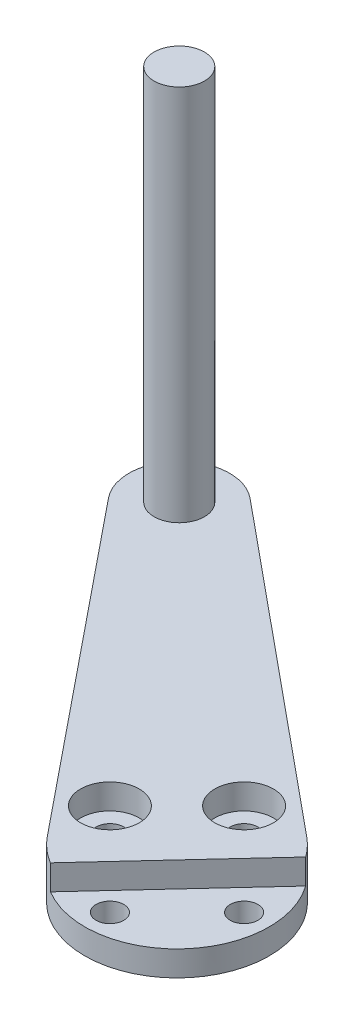
ISO-10303-21;
HEADER;
FILE_DESCRIPTION(('STEP AP214'),'2;1');
FILE_NAME('part.step','',(''),(''),'','','');
FILE_SCHEMA(('AUTOMOTIVE_DESIGN { 1 0 10303 214 1 1 1 1 }'));
ENDSEC;
DATA;
#1=APPLICATION_CONTEXT('core data for automotive mechanical design processes');
#2=APPLICATION_PROTOCOL_DEFINITION('international standard','automotive_design',2000,#1);
#3=PRODUCT_CONTEXT('',#1,'mechanical');
#4=PRODUCT('Part','Part','',(#3));
#5=PRODUCT_RELATED_PRODUCT_CATEGORY('part','',(#4));
#6=PRODUCT_DEFINITION_FORMATION('','',#4);
#7=PRODUCT_DEFINITION_CONTEXT('part definition',#1,'design');
#8=PRODUCT_DEFINITION('design','',#6,#7);
#9=PRODUCT_DEFINITION_SHAPE('','',#8);
#10=(LENGTH_UNIT() NAMED_UNIT(*) SI_UNIT(.MILLI.,.METRE.));
#11=(NAMED_UNIT(*) PLANE_ANGLE_UNIT() SI_UNIT($,.RADIAN.));
#12=(NAMED_UNIT(*) SI_UNIT($,.STERADIAN.) SOLID_ANGLE_UNIT());
#13=UNCERTAINTY_MEASURE_WITH_UNIT(LENGTH_MEASURE(1.E-05),#10,'distance_accuracy_value','');
#14=(GEOMETRIC_REPRESENTATION_CONTEXT(3) GLOBAL_UNCERTAINTY_ASSIGNED_CONTEXT((#13)) GLOBAL_UNIT_ASSIGNED_CONTEXT((#10,
#11,#12)) REPRESENTATION_CONTEXT('',''));
#15=CARTESIAN_POINT('',(0.,0.,0.));
#16=DIRECTION('',(0.,0.,1.));
#17=DIRECTION('',(1.,0.,0.));
#18=AXIS2_PLACEMENT_3D('',#15,#16,#17);
#19=CARTESIAN_POINT('',(-8.,8.,0.));
#20=DIRECTION('',(0.,-1.,0.));
#21=DIRECTION('',(0.,0.,-1.));
#22=AXIS2_PLACEMENT_3D('',#19,#20,#21);
#23=CYLINDRICAL_SURFACE('',#22,1.65);
#24=CARTESIAN_POINT('',(-8.,0.,0.));
#25=DIRECTION('',(0.,1.,0.));
#26=DIRECTION('',(0.,0.,1.));
#27=AXIS2_PLACEMENT_3D('',#24,#25,#26);
#28=CIRCLE('',#27,1.65);
#29=CARTESIAN_POINT('',(-8.,0.,1.65));
#30=VERTEX_POINT('',#29);
#31=EDGE_CURVE('E156',#30,#30,#28,.F.);
#32=ORIENTED_EDGE('',*,*,#31,.T.);
#33=EDGE_LOOP('',(#32));
#34=FACE_BOUND('',#33,.T.);
#35=CARTESIAN_POINT('',(-8.,3.,0.));
#36=DIRECTION('',(0.,1.,0.));
#37=DIRECTION('',(0.,0.,1.));
#38=AXIS2_PLACEMENT_3D('',#35,#36,#37);
#39=CIRCLE('',#38,1.65);
#40=CARTESIAN_POINT('',(-8.,3.,1.65));
#41=VERTEX_POINT('',#40);
#42=EDGE_CURVE('E145',#41,#41,#39,.T.);
#43=ORIENTED_EDGE('',*,*,#42,.T.);
#44=EDGE_LOOP('',(#43));
#45=FACE_BOUND('',#44,.T.);
#46=ADVANCED_FACE('F49',(#34,#45),#23,.F.);
#47=CARTESIAN_POINT('',(0.,8.,-8.));
#48=DIRECTION('',(0.,-1.,0.));
#49=DIRECTION('',(0.,0.,-1.));
#50=AXIS2_PLACEMENT_3D('',#47,#48,#49);
#51=CYLINDRICAL_SURFACE('',#50,1.65);
#52=CARTESIAN_POINT('',(0.,0.,-8.));
#53=DIRECTION('',(0.,1.,0.));
#54=DIRECTION('',(0.,0.,1.));
#55=AXIS2_PLACEMENT_3D('',#52,#53,#54);
#56=CIRCLE('',#55,1.65);
#57=CARTESIAN_POINT('',(0.,0.,-6.35));
#58=VERTEX_POINT('',#57);
#59=EDGE_CURVE('E161',#58,#58,#56,.F.);
#60=ORIENTED_EDGE('',*,*,#59,.T.);
#61=EDGE_LOOP('',(#60));
#62=FACE_BOUND('',#61,.T.);
#63=CARTESIAN_POINT('',(0.,3.,-8.));
#64=DIRECTION('',(0.,1.,0.));
#65=DIRECTION('',(0.,0.,1.));
#66=AXIS2_PLACEMENT_3D('',#63,#64,#65);
#67=CIRCLE('',#66,1.65);
#68=CARTESIAN_POINT('',(0.,3.,-6.35));
#69=VERTEX_POINT('',#68);
#70=EDGE_CURVE('E141',#69,#69,#67,.T.);
#71=ORIENTED_EDGE('',*,*,#70,.T.);
#72=EDGE_LOOP('',(#71));
#73=FACE_BOUND('',#72,.T.);
#74=ADVANCED_FACE('F241',(#62,#73),#51,.F.);
#75=CARTESIAN_POINT('',(0.,3.,0.));
#76=DIRECTION('',(0.,1.,0.));
#77=DIRECTION('',(0.,0.,1.));
#78=AXIS2_PLACEMENT_3D('',#75,#76,#77);
#79=PLANE('',#78);
#80=DIRECTION('',(0.678536663882205,0.,-0.734566535970437));
#81=VECTOR('',#80,1.);
#82=CARTESIAN_POINT('',(8.95227994632768,3.,-6.39192332264548));
#83=LINE('',#82,#81);
#84=CARTESIAN_POINT('',(-5.66305121885964,3.,9.43026250390583));
#85=VERTEX_POINT('',#84);
#86=CARTESIAN_POINT('',(8.95227994632768,3.,-6.39192332264548));
#87=VERTEX_POINT('',#86);
#88=EDGE_CURVE('E73',#85,#87,#83,.T.);
#89=ORIENTED_EDGE('',*,*,#88,.F.);
#90=CARTESIAN_POINT('',(0.,3.,0.));
#91=DIRECTION('',(0.,1.,0.));
#92=DIRECTION('',(0.,0.,1.));
#93=AXIS2_PLACEMENT_3D('',#90,#91,#92);
#94=CIRCLE('',#93,11.);
#95=EDGE_CURVE('E11',#85,#87,#94,.T.);
#96=ORIENTED_EDGE('',*,*,#95,.T.);
#97=EDGE_LOOP('',(#89,#96));
#98=FACE_BOUND('',#97,.T.);
#99=CARTESIAN_POINT('',(0.,3.,8.));
#100=DIRECTION('',(0.,1.,0.));
#101=DIRECTION('',(0.,0.,1.));
#102=AXIS2_PLACEMENT_3D('',#99,#100,#101);
#103=CIRCLE('',#102,1.65);
#104=CARTESIAN_POINT('',(0.,3.,9.65));
#105=VERTEX_POINT('',#104);
#106=EDGE_CURVE('E133',#105,#105,#103,.T.);
#107=ORIENTED_EDGE('',*,*,#106,.F.);
#108=EDGE_LOOP('',(#107));
#109=FACE_BOUND('',#108,.T.);
#110=CARTESIAN_POINT('',(8.,3.,0.));
#111=DIRECTION('',(0.,1.,0.));
#112=DIRECTION('',(0.,0.,1.));
#113=AXIS2_PLACEMENT_3D('',#110,#111,#112);
#114=CIRCLE('',#113,1.65);
#115=CARTESIAN_POINT('',(8.,3.,1.65));
#116=VERTEX_POINT('',#115);
#117=EDGE_CURVE('E216',#116,#116,#114,.T.);
#118=ORIENTED_EDGE('',*,*,#117,.F.);
#119=EDGE_LOOP('',(#118));
#120=FACE_BOUND('',#119,.T.);
#121=ADVANCED_FACE('F246',(#98,#109,#120),#79,.T.);
#122=CARTESIAN_POINT('',(0.,0.,0.));
#123=DIRECTION('',(0.,1.,0.));
#124=DIRECTION('',(0.,0.,1.));
#125=AXIS2_PLACEMENT_3D('',#122,#123,#124);
#126=PLANE('',#125);
#127=ORIENTED_EDGE('',*,*,#59,.F.);
#128=EDGE_LOOP('',(#127));
#129=FACE_BOUND('',#128,.T.);
#130=ORIENTED_EDGE('',*,*,#31,.F.);
#131=EDGE_LOOP('',(#130));
#132=FACE_BOUND('',#131,.T.);
#133=CARTESIAN_POINT('',(0.,0.,0.));
#134=DIRECTION('',(0.,1.,0.));
#135=DIRECTION('',(0.,0.,1.));
#136=AXIS2_PLACEMENT_3D('',#133,#134,#135);
#137=CIRCLE('',#136,11.);
#138=CARTESIAN_POINT('',(-8.54338219790299,0.,6.92896966514897));
#139=VERTEX_POINT('',#138);
#140=CARTESIAN_POINT('',(6.9936670001617,0.,-8.49050186330873));
#141=VERTEX_POINT('',#140);
#142=EDGE_CURVE('E59',#139,#141,#137,.T.);
#143=ORIENTED_EDGE('',*,*,#142,.F.);
#144=DIRECTION('',(0.62990633319536,0.,0.776671108900271));
#145=VECTOR('',#144,1.);
#146=CARTESIAN_POINT('',(-39.880826602067,0.,-31.7099301408229));
#147=LINE('',#146,#145);
#148=CARTESIAN_POINT('',(-39.880826602067,0.,-31.7099301408229));
#149=VERTEX_POINT('',#148);
#150=EDGE_CURVE('E117',#149,#139,#147,.T.);
#151=ORIENTED_EDGE('',*,*,#150,.F.);
#152=CARTESIAN_POINT('',(-35.2207999486653,0.,-35.4893681399951));
#153=DIRECTION('',(0.,1.,0.));
#154=DIRECTION('',(0.,0.,1.));
#155=AXIS2_PLACEMENT_3D('',#152,#153,#154);
#156=CIRCLE('',#155,6.00000000000001);
#157=CARTESIAN_POINT('',(-31.4060724940317,0.,-40.1205509745271));
#158=VERTEX_POINT('',#157);
#159=EDGE_CURVE('E126',#158,#149,#156,.T.);
#160=ORIENTED_EDGE('',*,*,#159,.F.);
#161=DIRECTION('',(-0.77186380575534,0.,-0.63578790910561));
#162=VECTOR('',#161,1.);
#163=CARTESIAN_POINT('',(-31.4060724940317,0.,-40.1205509745271));
#164=LINE('',#163,#162);
#165=EDGE_CURVE('E108',#141,#158,#164,.T.);
#166=ORIENTED_EDGE('',*,*,#165,.F.);
#167=EDGE_LOOP('',(#143,#151,#160,#166));
#168=FACE_BOUND('',#167,.T.);
#169=CARTESIAN_POINT('',(0.,0.,8.));
#170=DIRECTION('',(0.,1.,0.));
#171=DIRECTION('',(0.,0.,1.));
#172=AXIS2_PLACEMENT_3D('',#169,#170,#171);
#173=CIRCLE('',#172,1.65);
#174=CARTESIAN_POINT('',(0.,0.,9.65));
#175=VERTEX_POINT('',#174);
#176=EDGE_CURVE('E137',#175,#175,#173,.T.);
#177=ORIENTED_EDGE('',*,*,#176,.T.);
#178=EDGE_LOOP('',(#177));
#179=FACE_BOUND('',#178,.T.);
#180=CARTESIAN_POINT('',(8.,0.,0.));
#181=DIRECTION('',(0.,1.,0.));
#182=DIRECTION('',(0.,0.,1.));
#183=AXIS2_PLACEMENT_3D('',#180,#181,#182);
#184=CIRCLE('',#183,1.65);
#185=CARTESIAN_POINT('',(8.,0.,1.65));
#186=VERTEX_POINT('',#185);
#187=EDGE_CURVE('E215',#186,#186,#184,.T.);
#188=ORIENTED_EDGE('',*,*,#187,.T.);
#189=EDGE_LOOP('',(#188));
#190=FACE_BOUND('',#189,.T.);
#191=ADVANCED_FACE('F121',(#129,#132,#168,#179,#190),#126,.F.);
#192=CARTESIAN_POINT('',(0.,3.,0.));
#193=DIRECTION('',(0.,-1.,0.));
#194=DIRECTION('',(0.,0.,-1.));
#195=AXIS2_PLACEMENT_3D('',#192,#193,#194);
#196=CYLINDRICAL_SURFACE('',#195,11.);
#197=ORIENTED_EDGE('',*,*,#95,.F.);
#198=DIRECTION('',(0.,-1.,0.));
#199=VECTOR('',#198,1.);
#200=CARTESIAN_POINT('',(-5.66305121885965,6.,9.43026250390583));
#201=LINE('',#200,#199);
#202=CARTESIAN_POINT('',(-5.66305121885965,6.,9.43026250390583));
#203=VERTEX_POINT('',#202);
#204=EDGE_CURVE('E211',#203,#85,#201,.T.);
#205=ORIENTED_EDGE('',*,*,#204,.F.);
#206=CARTESIAN_POINT('',(0.,6.,0.));
#207=DIRECTION('',(0.,1.,0.));
#208=DIRECTION('',(0.,0.,1.));
#209=AXIS2_PLACEMENT_3D('',#206,#207,#208);
#210=CIRCLE('',#209,11.);
#211=CARTESIAN_POINT('',(-8.54338219790299,6.,6.92896966514897));
#212=VERTEX_POINT('',#211);
#213=EDGE_CURVE('E202',#212,#203,#210,.T.);
#214=ORIENTED_EDGE('',*,*,#213,.F.);
#215=DIRECTION('',(0.,1.,0.));
#216=VECTOR('',#215,1.);
#217=CARTESIAN_POINT('',(-8.54338219790299,0.,6.92896966514897));
#218=LINE('',#217,#216);
#219=EDGE_CURVE('E131',#139,#212,#218,.T.);
#220=ORIENTED_EDGE('',*,*,#219,.F.);
#221=ORIENTED_EDGE('',*,*,#142,.T.);
#222=DIRECTION('',(0.,1.,0.));
#223=VECTOR('',#222,1.);
#224=CARTESIAN_POINT('',(6.9936670001617,0.,-8.49050186330873));
#225=LINE('',#224,#223);
#226=CARTESIAN_POINT('',(6.9936670001617,6.,-8.49050186330873));
#227=VERTEX_POINT('',#226);
#228=EDGE_CURVE('E105',#141,#227,#225,.T.);
#229=ORIENTED_EDGE('',*,*,#228,.T.);
#230=CARTESIAN_POINT('',(8.95227994632768,6.,-6.39192332264548));
#231=VERTEX_POINT('',#230);
#232=EDGE_CURVE('E198',#231,#227,#210,.T.);
#233=ORIENTED_EDGE('',*,*,#232,.F.);
#234=DIRECTION('',(0.,-1.,0.));
#235=VECTOR('',#234,1.);
#236=CARTESIAN_POINT('',(8.95227994632768,6.,-6.39192332264548));
#237=LINE('',#236,#235);
#238=EDGE_CURVE('E205',#231,#87,#237,.T.);
#239=ORIENTED_EDGE('',*,*,#238,.T.);
#240=EDGE_LOOP('',(#197,#205,#214,#220,#221,#229,#233,#239));
#241=FACE_BOUND('',#240,.T.);
#242=ADVANCED_FACE('F51',(#241),#196,.T.);
#243=CARTESIAN_POINT('',(0.,3.,8.));
#244=DIRECTION('',(0.,-1.,0.));
#245=DIRECTION('',(0.,0.,-1.));
#246=AXIS2_PLACEMENT_3D('',#243,#244,#245);
#247=CYLINDRICAL_SURFACE('',#246,1.65);
#248=ORIENTED_EDGE('',*,*,#106,.T.);
#249=EDGE_LOOP('',(#248));
#250=FACE_BOUND('',#249,.T.);
#251=ORIENTED_EDGE('',*,*,#176,.F.);
#252=EDGE_LOOP('',(#251));
#253=FACE_BOUND('',#252,.T.);
#254=ADVANCED_FACE('F227',(#250,#253),#247,.F.);
#255=CARTESIAN_POINT('',(8.,3.,0.));
#256=DIRECTION('',(0.,-1.,0.));
#257=DIRECTION('',(0.,0.,-1.));
#258=AXIS2_PLACEMENT_3D('',#255,#256,#257);
#259=CYLINDRICAL_SURFACE('',#258,1.65);
#260=ORIENTED_EDGE('',*,*,#117,.T.);
#261=EDGE_LOOP('',(#260));
#262=FACE_BOUND('',#261,.T.);
#263=ORIENTED_EDGE('',*,*,#187,.F.);
#264=EDGE_LOOP('',(#263));
#265=FACE_BOUND('',#264,.T.);
#266=ADVANCED_FACE('F229',(#262,#265),#259,.F.);
#267=CARTESIAN_POINT('',(8.95227994632768,6.,-6.39192332264548));
#268=DIRECTION('',(-0.734566535970437,0.,-0.678536663882205));
#269=DIRECTION('',(-0.678536663882205,0.,0.734566535970437));
#270=AXIS2_PLACEMENT_3D('',#267,#268,#269);
#271=PLANE('',#270);
#272=ORIENTED_EDGE('',*,*,#88,.T.);
#273=ORIENTED_EDGE('',*,*,#238,.F.);
#274=DIRECTION('',(0.678536663882205,0.,-0.734566535970437));
#275=VECTOR('',#274,1.);
#276=CARTESIAN_POINT('',(8.95227994632768,6.,-6.39192332264548));
#277=LINE('',#276,#275);
#278=EDGE_CURVE('E201',#203,#231,#277,.T.);
#279=ORIENTED_EDGE('',*,*,#278,.F.);
#280=ORIENTED_EDGE('',*,*,#204,.T.);
#281=EDGE_LOOP('',(#272,#273,#279,#280));
#282=FACE_BOUND('',#281,.T.);
#283=ADVANCED_FACE('F235',(#282),#271,.F.);
#284=CARTESIAN_POINT('',(0.,6.,0.));
#285=DIRECTION('',(0.,1.,0.));
#286=DIRECTION('',(0.,0.,1.));
#287=AXIS2_PLACEMENT_3D('',#284,#285,#286);
#288=PLANE('',#287);
#289=CARTESIAN_POINT('',(0.,6.,-8.));
#290=DIRECTION('',(0.,1.,0.));
#291=DIRECTION('',(0.,0.,1.));
#292=AXIS2_PLACEMENT_3D('',#289,#290,#291);
#293=CIRCLE('',#292,3.5);
#294=CARTESIAN_POINT('',(0.,6.,-4.5));
#295=VERTEX_POINT('',#294);
#296=EDGE_CURVE('E53',#295,#295,#293,.F.);
#297=ORIENTED_EDGE('',*,*,#296,.T.);
#298=EDGE_LOOP('',(#297));
#299=FACE_BOUND('',#298,.T.);
#300=CARTESIAN_POINT('',(-8.,6.,0.));
#301=DIRECTION('',(0.,1.,0.));
#302=DIRECTION('',(0.,0.,1.));
#303=AXIS2_PLACEMENT_3D('',#300,#301,#302);
#304=CIRCLE('',#303,3.5);
#305=CARTESIAN_POINT('',(-8.,6.,3.5));
#306=VERTEX_POINT('',#305);
#307=EDGE_CURVE('E149',#306,#306,#304,.F.);
#308=ORIENTED_EDGE('',*,*,#307,.T.);
#309=EDGE_LOOP('',(#308));
#310=FACE_BOUND('',#309,.T.);
#311=CARTESIAN_POINT('',(-35.2207999486653,6.,-35.4893681399951));
#312=DIRECTION('',(0.,1.,0.));
#313=DIRECTION('',(0.,0.,1.));
#314=AXIS2_PLACEMENT_3D('',#311,#312,#313);
#315=CIRCLE('',#314,3.);
#316=CARTESIAN_POINT('',(-35.2207999486653,6.00000000000001,-38.4893681399951));
#317=VERTEX_POINT('',#316);
#318=EDGE_CURVE('E167',#317,#317,#315,.T.);
#319=ORIENTED_EDGE('',*,*,#318,.F.);
#320=EDGE_LOOP('',(#319));
#321=FACE_BOUND('',#320,.T.);
#322=ORIENTED_EDGE('',*,*,#232,.T.);
#323=DIRECTION('',(-0.77186380575534,0.,-0.63578790910561));
#324=VECTOR('',#323,1.);
#325=CARTESIAN_POINT('',(-31.4060724940317,6.,-40.1205509745271));
#326=LINE('',#325,#324);
#327=CARTESIAN_POINT('',(-31.4060724940317,6.,-40.1205509745271));
#328=VERTEX_POINT('',#327);
#329=EDGE_CURVE('E110',#227,#328,#326,.T.);
#330=ORIENTED_EDGE('',*,*,#329,.T.);
#331=CARTESIAN_POINT('',(-35.2207999486653,6.,-35.4893681399951));
#332=DIRECTION('',(0.,1.,0.));
#333=DIRECTION('',(0.,0.,1.));
#334=AXIS2_PLACEMENT_3D('',#331,#332,#333);
#335=CIRCLE('',#334,6.00000000000001);
#336=CARTESIAN_POINT('',(-39.880826602067,6.,-31.7099301408229));
#337=VERTEX_POINT('',#336);
#338=EDGE_CURVE('E186',#328,#337,#335,.T.);
#339=ORIENTED_EDGE('',*,*,#338,.T.);
#340=DIRECTION('',(0.62990633319536,0.,0.776671108900271));
#341=VECTOR('',#340,1.);
#342=CARTESIAN_POINT('',(-39.880826602067,6.,-31.7099301408229));
#343=LINE('',#342,#341);
#344=EDGE_CURVE('E67',#337,#212,#343,.T.);
#345=ORIENTED_EDGE('',*,*,#344,.T.);
#346=ORIENTED_EDGE('',*,*,#213,.T.);
#347=ORIENTED_EDGE('',*,*,#278,.T.);
#348=EDGE_LOOP('',(#322,#330,#339,#345,#346,#347));
#349=FACE_BOUND('',#348,.T.);
#350=ADVANCED_FACE('F265',(#299,#310,#321,#349),#288,.T.);
#351=CARTESIAN_POINT('',(-39.880826602067,0.,-31.7099301408229));
#352=DIRECTION('',(-0.776671108900271,0.,0.62990633319536));
#353=DIRECTION('',(0.62990633319536,0.,0.776671108900271));
#354=AXIS2_PLACEMENT_3D('',#351,#352,#353);
#355=PLANE('',#354);
#356=ORIENTED_EDGE('',*,*,#344,.F.);
#357=DIRECTION('',(0.,1.,0.));
#358=VECTOR('',#357,1.);
#359=CARTESIAN_POINT('',(-39.880826602067,0.,-31.7099301408229));
#360=LINE('',#359,#358);
#361=EDGE_CURVE('E193',#149,#337,#360,.T.);
#362=ORIENTED_EDGE('',*,*,#361,.F.);
#363=ORIENTED_EDGE('',*,*,#150,.T.);
#364=ORIENTED_EDGE('',*,*,#219,.T.);
#365=EDGE_LOOP('',(#356,#362,#363,#364));
#366=FACE_BOUND('',#365,.T.);
#367=ADVANCED_FACE('F261',(#366),#355,.T.);
#368=CARTESIAN_POINT('',(-35.2207999486653,0.,-35.4893681399951));
#369=DIRECTION('',(0.,1.,0.));
#370=DIRECTION('',(0.,0.,1.));
#371=AXIS2_PLACEMENT_3D('',#368,#369,#370);
#372=CYLINDRICAL_SURFACE('',#371,6.00000000000001);
#373=ORIENTED_EDGE('',*,*,#338,.F.);
#374=DIRECTION('',(0.,1.,0.));
#375=VECTOR('',#374,1.);
#376=CARTESIAN_POINT('',(-31.4060724940317,0.,-40.1205509745271));
#377=LINE('',#376,#375);
#378=EDGE_CURVE('E116',#158,#328,#377,.T.);
#379=ORIENTED_EDGE('',*,*,#378,.F.);
#380=ORIENTED_EDGE('',*,*,#159,.T.);
#381=ORIENTED_EDGE('',*,*,#361,.T.);
#382=EDGE_LOOP('',(#373,#379,#380,#381));
#383=FACE_BOUND('',#382,.T.);
#384=ADVANCED_FACE('F264',(#383),#372,.T.);
#385=CARTESIAN_POINT('',(-31.4060724940317,0.,-40.1205509745271));
#386=DIRECTION('',(0.63578790910561,0.,-0.77186380575534));
#387=DIRECTION('',(-0.77186380575534,0.,-0.63578790910561));
#388=AXIS2_PLACEMENT_3D('',#385,#386,#387);
#389=PLANE('',#388);
#390=ORIENTED_EDGE('',*,*,#329,.F.);
#391=ORIENTED_EDGE('',*,*,#228,.F.);
#392=ORIENTED_EDGE('',*,*,#165,.T.);
#393=ORIENTED_EDGE('',*,*,#378,.T.);
#394=EDGE_LOOP('',(#390,#391,#392,#393));
#395=FACE_BOUND('',#394,.T.);
#396=ADVANCED_FACE('F107',(#395),#389,.T.);
#397=CARTESIAN_POINT('',(-35.2207999486653,51.,-35.4893681399951));
#398=DIRECTION('',(0.,-1.,0.));
#399=DIRECTION('',(0.,0.,-1.));
#400=AXIS2_PLACEMENT_3D('',#397,#398,#399);
#401=CYLINDRICAL_SURFACE('',#400,3.);
#402=CARTESIAN_POINT('',(-35.2207999486653,51.,-35.4893681399951));
#403=DIRECTION('',(0.,1.,0.));
#404=DIRECTION('',(0.,0.,1.));
#405=AXIS2_PLACEMENT_3D('',#402,#403,#404);
#406=CIRCLE('',#405,3.);
#407=CARTESIAN_POINT('',(-35.2207999486653,51.,-38.4893681399951));
#408=VERTEX_POINT('',#407);
#409=EDGE_CURVE('E173',#408,#408,#406,.T.);
#410=CARTESIAN_POINT('',(-35.2207999486653,51.,-38.4893681399951));
#411=CARTESIAN_POINT('',(-35.2207999486653,50.53125,-38.4893681399951));
#412=CARTESIAN_POINT('',(-35.2207999486653,50.0625,-38.4893681399951));
#413=CARTESIAN_POINT('',(-35.2207999486653,49.125,-38.4893681399951));
#414=CARTESIAN_POINT('',(-35.2207999486653,48.65625,-38.4893681399951));
#415=CARTESIAN_POINT('',(-35.2207999486653,47.71875,-38.4893681399951));
#416=CARTESIAN_POINT('',(-35.2207999486653,47.25,-38.4893681399951));
#417=CARTESIAN_POINT('',(-35.2207999486653,46.3125,-38.4893681399951));
#418=CARTESIAN_POINT('',(-35.2207999486653,45.84375,-38.4893681399951));
#419=CARTESIAN_POINT('',(-35.2207999486653,44.90625,-38.4893681399951));
#420=CARTESIAN_POINT('',(-35.2207999486653,44.4375,-38.4893681399951));
#421=CARTESIAN_POINT('',(-35.2207999486653,43.5,-38.4893681399951));
#422=CARTESIAN_POINT('',(-35.2207999486653,43.03125,-38.4893681399951));
#423=CARTESIAN_POINT('',(-35.2207999486653,42.09375,-38.4893681399951));
#424=CARTESIAN_POINT('',(-35.2207999486653,41.625,-38.4893681399951));
#425=CARTESIAN_POINT('',(-35.2207999486653,40.6875,-38.4893681399951));
#426=CARTESIAN_POINT('',(-35.2207999486653,40.21875,-38.4893681399951));
#427=CARTESIAN_POINT('',(-35.2207999486653,39.28125,-38.4893681399951));
#428=CARTESIAN_POINT('',(-35.2207999486653,38.8125,-38.4893681399951));
#429=CARTESIAN_POINT('',(-35.2207999486653,37.875,-38.4893681399951));
#430=CARTESIAN_POINT('',(-35.2207999486653,37.40625,-38.4893681399951));
#431=CARTESIAN_POINT('',(-35.2207999486653,36.46875,-38.4893681399951));
#432=CARTESIAN_POINT('',(-35.2207999486653,36.,-38.4893681399951));
#433=CARTESIAN_POINT('',(-35.2207999486653,35.0625,-38.4893681399951));
#434=CARTESIAN_POINT('',(-35.2207999486653,34.59375,-38.4893681399951));
#435=CARTESIAN_POINT('',(-35.2207999486653,33.65625,-38.4893681399951));
#436=CARTESIAN_POINT('',(-35.2207999486653,33.1875,-38.4893681399951));
#437=CARTESIAN_POINT('',(-35.2207999486653,32.25,-38.4893681399951));
#438=CARTESIAN_POINT('',(-35.2207999486653,31.78125,-38.4893681399951));
#439=CARTESIAN_POINT('',(-35.2207999486653,30.84375,-38.4893681399951));
#440=CARTESIAN_POINT('',(-35.2207999486653,30.375,-38.4893681399951));
#441=CARTESIAN_POINT('',(-35.2207999486653,29.4375,-38.4893681399951));
#442=CARTESIAN_POINT('',(-35.2207999486653,28.96875,-38.4893681399951));
#443=CARTESIAN_POINT('',(-35.2207999486653,28.03125,-38.4893681399951));
#444=CARTESIAN_POINT('',(-35.2207999486653,27.5625,-38.4893681399951));
#445=CARTESIAN_POINT('',(-35.2207999486653,26.625,-38.4893681399951));
#446=CARTESIAN_POINT('',(-35.2207999486653,26.15625,-38.4893681399951));
#447=CARTESIAN_POINT('',(-35.2207999486653,25.21875,-38.4893681399951));
#448=CARTESIAN_POINT('',(-35.2207999486653,24.75,-38.4893681399951));
#449=CARTESIAN_POINT('',(-35.2207999486653,23.8125,-38.4893681399951));
#450=CARTESIAN_POINT('',(-35.2207999486653,23.34375,-38.4893681399951));
#451=CARTESIAN_POINT('',(-35.2207999486653,22.40625,-38.4893681399951));
#452=CARTESIAN_POINT('',(-35.2207999486653,21.9375,-38.4893681399951));
#453=CARTESIAN_POINT('',(-35.2207999486653,21.,-38.4893681399951));
#454=CARTESIAN_POINT('',(-35.2207999486653,20.53125,-38.4893681399951));
#455=CARTESIAN_POINT('',(-35.2207999486653,19.59375,-38.4893681399951));
#456=CARTESIAN_POINT('',(-35.2207999486653,19.125,-38.4893681399951));
#457=CARTESIAN_POINT('',(-35.2207999486653,18.1875,-38.4893681399951));
#458=CARTESIAN_POINT('',(-35.2207999486653,17.71875,-38.4893681399951));
#459=CARTESIAN_POINT('',(-35.2207999486653,16.78125,-38.4893681399951));
#460=CARTESIAN_POINT('',(-35.2207999486653,16.3125,-38.4893681399951));
#461=CARTESIAN_POINT('',(-35.2207999486653,15.375,-38.4893681399951));
#462=CARTESIAN_POINT('',(-35.2207999486653,14.90625,-38.4893681399951));
#463=CARTESIAN_POINT('',(-35.2207999486653,13.96875,-38.4893681399951));
#464=CARTESIAN_POINT('',(-35.2207999486653,13.5,-38.4893681399951));
#465=CARTESIAN_POINT('',(-35.2207999486653,12.5625,-38.4893681399951));
#466=CARTESIAN_POINT('',(-35.2207999486653,12.09375,-38.4893681399951));
#467=CARTESIAN_POINT('',(-35.2207999486653,11.15625,-38.4893681399951));
#468=CARTESIAN_POINT('',(-35.2207999486653,10.6875,-38.4893681399951));
#469=CARTESIAN_POINT('',(-35.2207999486653,9.75000000000001,-38.4893681399951));
#470=CARTESIAN_POINT('',(-35.2207999486653,9.28125000000001,-38.4893681399951));
#471=CARTESIAN_POINT('',(-35.2207999486653,8.34375000000001,-38.4893681399951));
#472=CARTESIAN_POINT('',(-35.2207999486653,7.87500000000001,-38.4893681399951));
#473=CARTESIAN_POINT('',(-35.2207999486653,6.9375,-38.4893681399951));
#474=CARTESIAN_POINT('',(-35.2207999486653,6.46875,-38.4893681399951));
#475=CARTESIAN_POINT('',(-35.2207999486653,6.00000000000001,-38.4893681399951));
#476=B_SPLINE_CURVE_WITH_KNOTS('',3,(#410,#411,#412,#413,#414,#415,#416,#417,#418,#419,#420,
#421,#422,#423,#424,#425,#426,#427,#428,#429,#430,#431,#432,#433,#434,#435,#436,#437,#438,#439,
#440,#441,#442,#443,#444,#445,#446,#447,#448,#449,#450,#451,#452,#453,#454,#455,#456,#457,#458,
#459,#460,#461,#462,#463,#464,#465,#466,#467,#468,#469,#470,#471,#472,#473,#474,#475),
.UNSPECIFIED.,.F.,.F.,(4,2,2,2,2,2,2,2,2,2,2,2,2,2,2,2,2,2,2,2,2,2,2,2,2,2,2,2,2,2,2,2,4),(0.,
1.40625,2.8125,4.21875,5.62500000000001,7.03125,8.4375,9.84375000000001,11.25,12.65625,14.0625,
15.46875,16.875,18.28125,19.6875,21.09375,22.5,23.90625,25.3125,26.71875,28.125,29.53125,
30.9375,32.34375,33.75,35.15625,36.5625,37.96875,39.375,40.78125,42.1875,43.59375,45.),.UNSPECIFIED.);
#477=EDGE_CURVE('BSEAM256',#408,#317,#476,.T.);
#478=ORIENTED_EDGE('',*,*,#409,.F.);
#479=ORIENTED_EDGE('',*,*,#318,.T.);
#480=ORIENTED_EDGE('',*,*,#477,.T.);
#481=ORIENTED_EDGE('',*,*,#477,.F.);
#482=EDGE_LOOP('',(#478,#480,#479,#481));
#483=FACE_BOUND('',#482,.T.);
#484=ADVANCED_FACE('F256',(#483),#401,.T.);
#485=CARTESIAN_POINT('',(-35.2207999486653,51.,-35.4893681399951));
#486=DIRECTION('',(0.,1.,0.));
#487=DIRECTION('',(0.,0.,1.));
#488=AXIS2_PLACEMENT_3D('',#485,#486,#487);
#489=PLANE('',#488);
#490=ORIENTED_EDGE('',*,*,#409,.T.);
#491=EDGE_LOOP('',(#490));
#492=FACE_BOUND('',#491,.T.);
#493=ADVANCED_FACE('F252',(#492),#489,.T.);
#494=CARTESIAN_POINT('',(0.,7.,-8.));
#495=DIRECTION('',(0.,-1.,0.));
#496=DIRECTION('',(0.,0.,-1.));
#497=AXIS2_PLACEMENT_3D('',#494,#495,#496);
#498=CYLINDRICAL_SURFACE('',#497,3.5);
#499=ORIENTED_EDGE('',*,*,#296,.F.);
#500=EDGE_LOOP('',(#499));
#501=FACE_BOUND('',#500,.T.);
#502=CARTESIAN_POINT('',(0.,3.,-8.));
#503=DIRECTION('',(0.,1.,0.));
#504=DIRECTION('',(0.,0.,1.));
#505=AXIS2_PLACEMENT_3D('',#502,#503,#504);
#506=CIRCLE('',#505,3.5);
#507=CARTESIAN_POINT('',(0.,3.,-4.5));
#508=VERTEX_POINT('',#507);
#509=EDGE_CURVE('E146',#508,#508,#506,.T.);
#510=ORIENTED_EDGE('',*,*,#509,.F.);
#511=EDGE_LOOP('',(#510));
#512=FACE_BOUND('',#511,.T.);
#513=ADVANCED_FACE('F255',(#501,#512),#498,.F.);
#514=CARTESIAN_POINT('',(0.,3.,-8.));
#515=DIRECTION('',(0.,1.,0.));
#516=DIRECTION('',(0.,0.,1.));
#517=AXIS2_PLACEMENT_3D('',#514,#515,#516);
#518=PLANE('',#517);
#519=ORIENTED_EDGE('',*,*,#70,.F.);
#520=EDGE_LOOP('',(#519));
#521=FACE_BOUND('',#520,.T.);
#522=ORIENTED_EDGE('',*,*,#509,.T.);
#523=EDGE_LOOP('',(#522));
#524=FACE_BOUND('',#523,.T.);
#525=ADVANCED_FACE('F301',(#521,#524),#518,.T.);
#526=CARTESIAN_POINT('',(-8.,7.,0.));
#527=DIRECTION('',(0.,-1.,0.));
#528=DIRECTION('',(0.,0.,-1.));
#529=AXIS2_PLACEMENT_3D('',#526,#527,#528);
#530=CYLINDRICAL_SURFACE('',#529,3.5);
#531=ORIENTED_EDGE('',*,*,#307,.F.);
#532=EDGE_LOOP('',(#531));
#533=FACE_BOUND('',#532,.T.);
#534=CARTESIAN_POINT('',(-8.,3.,0.));
#535=DIRECTION('',(0.,1.,0.));
#536=DIRECTION('',(0.,0.,1.));
#537=AXIS2_PLACEMENT_3D('',#534,#535,#536);
#538=CIRCLE('',#537,3.5);
#539=CARTESIAN_POINT('',(-8.,3.,3.5));
#540=VERTEX_POINT('',#539);
#541=EDGE_CURVE('E170',#540,#540,#538,.T.);
#542=ORIENTED_EDGE('',*,*,#541,.F.);
#543=EDGE_LOOP('',(#542));
#544=FACE_BOUND('',#543,.T.);
#545=ADVANCED_FACE('F304',(#533,#544),#530,.F.);
#546=CARTESIAN_POINT('',(-8.,3.,0.));
#547=DIRECTION('',(0.,1.,0.));
#548=DIRECTION('',(0.,0.,1.));
#549=AXIS2_PLACEMENT_3D('',#546,#547,#548);
#550=PLANE('',#549);
#551=ORIENTED_EDGE('',*,*,#42,.F.);
#552=EDGE_LOOP('',(#551));
#553=FACE_BOUND('',#552,.T.);
#554=ORIENTED_EDGE('',*,*,#541,.T.);
#555=EDGE_LOOP('',(#554));
#556=FACE_BOUND('',#555,.T.);
#557=ADVANCED_FACE('F314',(#553,#556),#550,.T.);
#558=CLOSED_SHELL('',(#46,#74,#121,#191,#242,#254,#266,#283,#350,#367,#384,#396,#484,#493,#513,
#525,#545,#557));
#559=MANIFOLD_SOLID_BREP('B2',#558);
#560=ADVANCED_BREP_SHAPE_REPRESENTATION('',(#18,#559),#14);
#561=SHAPE_DEFINITION_REPRESENTATION(#9,#560);
ENDSEC;
END-ISO-10303-21;
